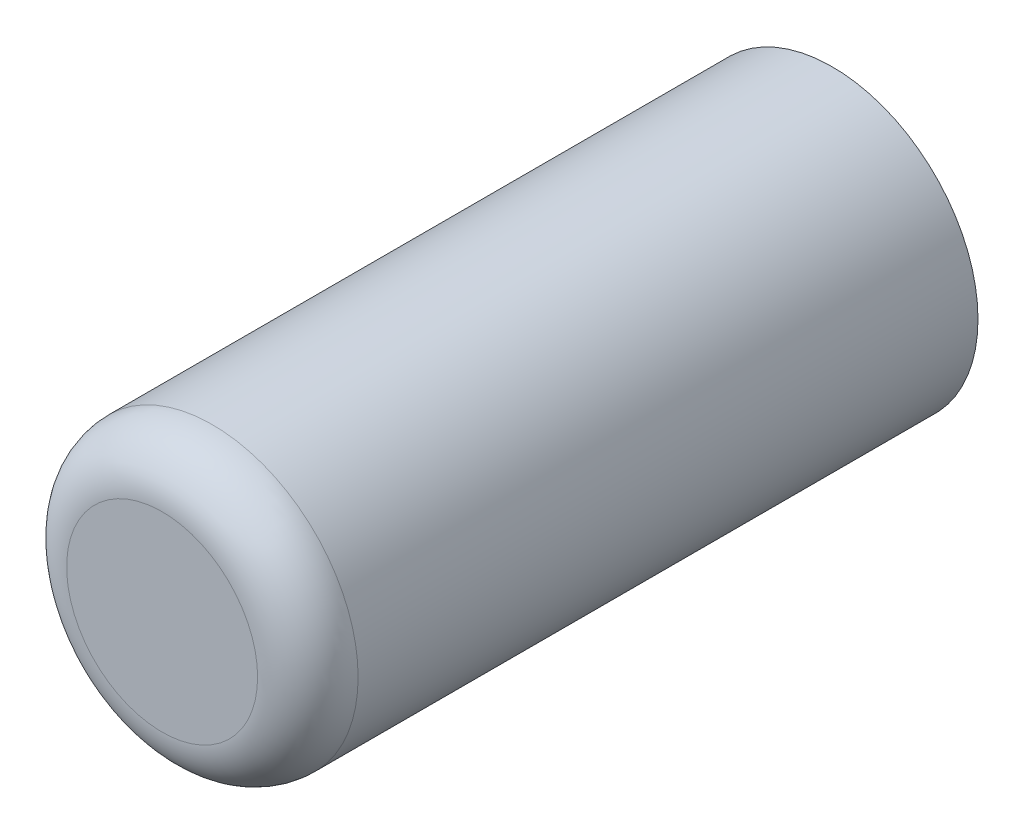
ISO-10303-21;
HEADER;
FILE_DESCRIPTION(('STEP AP214'),'2;1');
FILE_NAME('part.step','',(''),(''),'','','');
FILE_SCHEMA(('AUTOMOTIVE_DESIGN { 1 0 10303 214 1 1 1 1 }'));
ENDSEC;
DATA;
#1=APPLICATION_CONTEXT('core data for automotive mechanical design processes');
#2=APPLICATION_PROTOCOL_DEFINITION('international standard','automotive_design',2000,#1);
#3=PRODUCT_CONTEXT('',#1,'mechanical');
#4=PRODUCT('Part','Part','',(#3));
#5=PRODUCT_RELATED_PRODUCT_CATEGORY('part','',(#4));
#6=PRODUCT_DEFINITION_FORMATION('','',#4);
#7=PRODUCT_DEFINITION_CONTEXT('part definition',#1,'design');
#8=PRODUCT_DEFINITION('design','',#6,#7);
#9=PRODUCT_DEFINITION_SHAPE('','',#8);
#10=(LENGTH_UNIT() NAMED_UNIT(*) SI_UNIT(.MILLI.,.METRE.));
#11=(NAMED_UNIT(*) PLANE_ANGLE_UNIT() SI_UNIT($,.RADIAN.));
#12=(NAMED_UNIT(*) SI_UNIT($,.STERADIAN.) SOLID_ANGLE_UNIT());
#13=UNCERTAINTY_MEASURE_WITH_UNIT(LENGTH_MEASURE(1.E-05),#10,'distance_accuracy_value','');
#14=(GEOMETRIC_REPRESENTATION_CONTEXT(3) GLOBAL_UNCERTAINTY_ASSIGNED_CONTEXT((#13)) GLOBAL_UNIT_ASSIGNED_CONTEXT((#10,
#11,#12)) REPRESENTATION_CONTEXT('',''));
#15=CARTESIAN_POINT('',(0.,0.,0.));
#16=DIRECTION('',(0.,0.,1.));
#17=DIRECTION('',(1.,0.,0.));
#18=AXIS2_PLACEMENT_3D('',#15,#16,#17);
#19=CARTESIAN_POINT('',(0.,0.,133.35));
#20=DIRECTION('',(0.,0.,-1.));
#21=DIRECTION('',(-1.,0.,0.));
#22=AXIS2_PLACEMENT_3D('',#19,#20,#21);
#23=CYLINDRICAL_SURFACE('',#22,29.);
#24=CARTESIAN_POINT('',(0.,0.,123.35));
#25=DIRECTION('',(0.,0.,1.));
#26=DIRECTION('',(1.,0.,0.));
#27=AXIS2_PLACEMENT_3D('',#24,#25,#26);
#28=CIRCLE('',#27,29.);
#29=CARTESIAN_POINT('',(29.,0.,123.35));
#30=VERTEX_POINT('',#29);
#31=EDGE_CURVE('E10',#30,#30,#28,.F.);
#32=ORIENTED_EDGE('',*,*,#31,.T.);
#33=EDGE_LOOP('',(#32));
#34=FACE_BOUND('',#33,.T.);
#35=CARTESIAN_POINT('',(0.,0.,0.));
#36=DIRECTION('',(0.,0.,1.));
#37=DIRECTION('',(1.,0.,0.));
#38=AXIS2_PLACEMENT_3D('',#35,#36,#37);
#39=CIRCLE('',#38,29.);
#40=CARTESIAN_POINT('',(29.,0.,0.));
#41=VERTEX_POINT('',#40);
#42=EDGE_CURVE('E62',#41,#41,#39,.T.);
#43=ORIENTED_EDGE('',*,*,#42,.T.);
#44=EDGE_LOOP('',(#43));
#45=FACE_BOUND('',#44,.T.);
#46=ADVANCED_FACE('F49',(#34,#45),#23,.T.);
#47=CARTESIAN_POINT('',(0.,0.,133.35));
#48=DIRECTION('',(0.,0.,1.));
#49=DIRECTION('',(1.,0.,0.));
#50=AXIS2_PLACEMENT_3D('',#47,#48,#49);
#51=PLANE('',#50);
#52=CARTESIAN_POINT('',(0.,0.,133.35));
#53=DIRECTION('',(0.,0.,1.));
#54=DIRECTION('',(1.,0.,0.));
#55=AXIS2_PLACEMENT_3D('',#52,#53,#54);
#56=CIRCLE('',#55,19.);
#57=CARTESIAN_POINT('',(19.,0.,133.35));
#58=VERTEX_POINT('',#57);
#59=EDGE_CURVE('E57',#58,#58,#56,.T.);
#60=ORIENTED_EDGE('',*,*,#59,.T.);
#61=EDGE_LOOP('',(#60));
#62=FACE_BOUND('',#61,.T.);
#63=ADVANCED_FACE('F95',(#62),#51,.T.);
#64=CARTESIAN_POINT('',(0.,0.,0.));
#65=DIRECTION('',(0.,0.,1.));
#66=DIRECTION('',(1.,0.,0.));
#67=AXIS2_PLACEMENT_3D('',#64,#65,#66);
#68=PLANE('',#67);
#69=CARTESIAN_POINT('',(0.,0.,0.));
#70=DIRECTION('',(0.,0.,1.));
#71=DIRECTION('',(1.,0.,0.));
#72=AXIS2_PLACEMENT_3D('',#69,#70,#71);
#73=CIRCLE('',#72,28.);
#74=CARTESIAN_POINT('',(28.,0.,0.));
#75=VERTEX_POINT('',#74);
#76=EDGE_CURVE('E70',#75,#75,#73,.T.);
#77=ORIENTED_EDGE('',*,*,#76,.T.);
#78=EDGE_LOOP('',(#77));
#79=FACE_BOUND('',#78,.T.);
#80=ORIENTED_EDGE('',*,*,#42,.F.);
#81=EDGE_LOOP('',(#80));
#82=FACE_BOUND('',#81,.T.);
#83=ADVANCED_FACE('F92',(#79,#82),#68,.F.);
#84=CARTESIAN_POINT('',(0.,0.,123.35));
#85=DIRECTION('',(0.,0.,1.));
#86=DIRECTION('',(1.,0.,0.));
#87=AXIS2_PLACEMENT_3D('',#84,#85,#86);
#88=TOROIDAL_SURFACE('',#87,19.,10.);
#89=ORIENTED_EDGE('',*,*,#31,.F.);
#90=EDGE_LOOP('',(#89));
#91=FACE_BOUND('',#90,.T.);
#92=ORIENTED_EDGE('',*,*,#59,.F.);
#93=EDGE_LOOP('',(#92));
#94=FACE_BOUND('',#93,.T.);
#95=ADVANCED_FACE('F51',(#91,#94),#88,.T.);
#96=CARTESIAN_POINT('',(0.,0.,133.35));
#97=DIRECTION('',(0.,0.,-1.));
#98=DIRECTION('',(-1.,0.,0.));
#99=AXIS2_PLACEMENT_3D('',#96,#97,#98);
#100=CYLINDRICAL_SURFACE('',#99,28.);
#101=CARTESIAN_POINT('',(0.,0.,123.35));
#102=DIRECTION('',(0.,0.,-1.));
#103=DIRECTION('',(-1.,0.,0.));
#104=AXIS2_PLACEMENT_3D('',#101,#102,#103);
#105=CIRCLE('',#104,28.);
#106=CARTESIAN_POINT('',(-28.,0.,123.35));
#107=VERTEX_POINT('',#106);
#108=EDGE_CURVE('E67',#107,#107,#105,.T.);
#109=ORIENTED_EDGE('',*,*,#108,.F.);
#110=EDGE_LOOP('',(#109));
#111=FACE_BOUND('',#110,.T.);
#112=ORIENTED_EDGE('',*,*,#76,.F.);
#113=EDGE_LOOP('',(#112));
#114=FACE_BOUND('',#113,.T.);
#115=ADVANCED_FACE('F85',(#111,#114),#100,.F.);
#116=CARTESIAN_POINT('',(0.,0.,132.35));
#117=DIRECTION('',(0.,0.,1.));
#118=DIRECTION('',(1.,0.,0.));
#119=AXIS2_PLACEMENT_3D('',#116,#117,#118);
#120=PLANE('',#119);
#121=CARTESIAN_POINT('',(0.,0.,132.35));
#122=DIRECTION('',(0.,0.,1.));
#123=DIRECTION('',(1.,0.,0.));
#124=AXIS2_PLACEMENT_3D('',#121,#122,#123);
#125=CIRCLE('',#124,19.);
#126=CARTESIAN_POINT('',(19.,0.,132.35));
#127=VERTEX_POINT('',#126);
#128=EDGE_CURVE('E74',#127,#127,#125,.T.);
#129=ORIENTED_EDGE('',*,*,#128,.F.);
#130=EDGE_LOOP('',(#129));
#131=FACE_BOUND('',#130,.T.);
#132=ADVANCED_FACE('F88',(#131),#120,.F.);
#133=CARTESIAN_POINT('',(0.,0.,123.35));
#134=DIRECTION('',(0.,0.,1.));
#135=DIRECTION('',(1.,0.,0.));
#136=AXIS2_PLACEMENT_3D('',#133,#134,#135);
#137=TOROIDAL_SURFACE('',#136,19.,9.);
#138=ORIENTED_EDGE('',*,*,#108,.T.);
#139=EDGE_LOOP('',(#138));
#140=FACE_BOUND('',#139,.T.);
#141=ORIENTED_EDGE('',*,*,#128,.T.);
#142=EDGE_LOOP('',(#141));
#143=FACE_BOUND('',#142,.T.);
#144=ADVANCED_FACE('F82',(#140,#143),#137,.F.);
#145=CLOSED_SHELL('',(#46,#63,#83,#95,#115,#132,#144));
#146=MANIFOLD_SOLID_BREP('B2',#145);
#147=ADVANCED_BREP_SHAPE_REPRESENTATION('',(#18,#146),#14);
#148=SHAPE_DEFINITION_REPRESENTATION(#9,#147);
ENDSEC;
END-ISO-10303-21;
